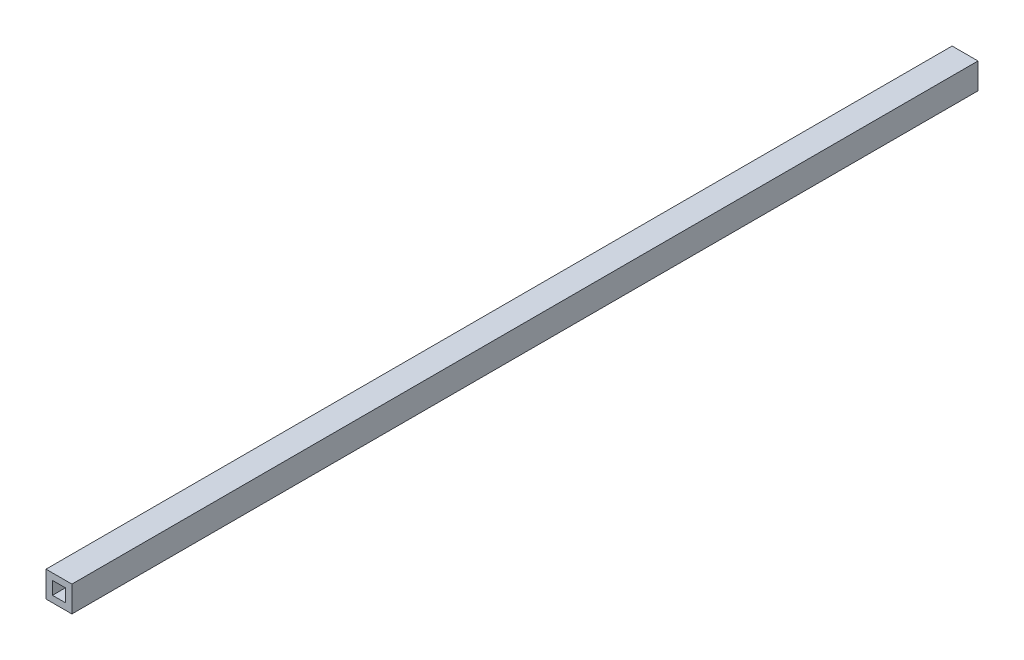
ISO-10303-21;
HEADER;
FILE_DESCRIPTION(('STEP AP214'),'2;1');
FILE_NAME('part.step','',(''),(''),'','','');
FILE_SCHEMA(('AUTOMOTIVE_DESIGN { 1 0 10303 214 1 1 1 1 }'));
ENDSEC;
DATA;
#1=APPLICATION_CONTEXT('core data for automotive mechanical design processes');
#2=APPLICATION_PROTOCOL_DEFINITION('international standard','automotive_design',2000,#1);
#3=PRODUCT_CONTEXT('',#1,'mechanical');
#4=PRODUCT('Part','Part','',(#3));
#5=PRODUCT_RELATED_PRODUCT_CATEGORY('part','',(#4));
#6=PRODUCT_DEFINITION_FORMATION('','',#4);
#7=PRODUCT_DEFINITION_CONTEXT('part definition',#1,'design');
#8=PRODUCT_DEFINITION('design','',#6,#7);
#9=PRODUCT_DEFINITION_SHAPE('','',#8);
#10=(LENGTH_UNIT() NAMED_UNIT(*) SI_UNIT(.MILLI.,.METRE.));
#11=(NAMED_UNIT(*) PLANE_ANGLE_UNIT() SI_UNIT($,.RADIAN.));
#12=(NAMED_UNIT(*) SI_UNIT($,.STERADIAN.) SOLID_ANGLE_UNIT());
#13=UNCERTAINTY_MEASURE_WITH_UNIT(LENGTH_MEASURE(1.E-05),#10,'distance_accuracy_value','');
#14=(GEOMETRIC_REPRESENTATION_CONTEXT(3) GLOBAL_UNCERTAINTY_ASSIGNED_CONTEXT((#13)) GLOBAL_UNIT_ASSIGNED_CONTEXT((#10,
#11,#12)) REPRESENTATION_CONTEXT('',''));
#15=CARTESIAN_POINT('',(0.,0.,0.));
#16=DIRECTION('',(0.,0.,1.));
#17=DIRECTION('',(1.,0.,0.));
#18=AXIS2_PLACEMENT_3D('',#15,#16,#17);
#19=CARTESIAN_POINT('',(0.,0.,700.));
#20=DIRECTION('',(0.,0.,1.));
#21=DIRECTION('',(1.,0.,0.));
#22=AXIS2_PLACEMENT_3D('',#19,#20,#21);
#23=PLANE('',#22);
#24=DIRECTION('',(0.,1.,0.));
#25=VECTOR('',#24,1.);
#26=CARTESIAN_POINT('',(10.,-10.,700.));
#27=LINE('',#26,#25);
#28=CARTESIAN_POINT('',(10.,-10.,700.));
#29=VERTEX_POINT('',#28);
#30=CARTESIAN_POINT('',(10.,10.,700.));
#31=VERTEX_POINT('',#30);
#32=EDGE_CURVE('E158',#29,#31,#27,.T.);
#33=ORIENTED_EDGE('',*,*,#32,.T.);
#34=DIRECTION('',(-1.,0.,0.));
#35=VECTOR('',#34,1.);
#36=CARTESIAN_POINT('',(-10.,10.,700.));
#37=LINE('',#36,#35);
#38=CARTESIAN_POINT('',(-10.,10.,700.));
#39=VERTEX_POINT('',#38);
#40=EDGE_CURVE('E161',#31,#39,#37,.T.);
#41=ORIENTED_EDGE('',*,*,#40,.T.);
#42=DIRECTION('',(0.,-1.,0.));
#43=VECTOR('',#42,1.);
#44=CARTESIAN_POINT('',(-10.,-10.,700.));
#45=LINE('',#44,#43);
#46=CARTESIAN_POINT('',(-10.,-10.,700.));
#47=VERTEX_POINT('',#46);
#48=EDGE_CURVE('E164',#39,#47,#45,.T.);
#49=ORIENTED_EDGE('',*,*,#48,.T.);
#50=DIRECTION('',(1.,0.,0.));
#51=VECTOR('',#50,1.);
#52=CARTESIAN_POINT('',(-10.,-10.,700.));
#53=LINE('',#52,#51);
#54=EDGE_CURVE('E166',#47,#29,#53,.T.);
#55=ORIENTED_EDGE('',*,*,#54,.T.);
#56=EDGE_LOOP('',(#33,#41,#49,#55));
#57=FACE_BOUND('',#56,.T.);
#58=DIRECTION('',(-1.,0.,0.));
#59=VECTOR('',#58,1.);
#60=CARTESIAN_POINT('',(0.,5.,700.));
#61=LINE('',#60,#59);
#62=CARTESIAN_POINT('',(5.,5.,700.));
#63=VERTEX_POINT('',#62);
#64=CARTESIAN_POINT('',(-5.,5.,700.));
#65=VERTEX_POINT('',#64);
#66=EDGE_CURVE('E130',#63,#65,#61,.T.);
#67=ORIENTED_EDGE('',*,*,#66,.F.);
#68=DIRECTION('',(0.,1.,0.));
#69=VECTOR('',#68,1.);
#70=CARTESIAN_POINT('',(5.,0.,700.));
#71=LINE('',#70,#69);
#72=CARTESIAN_POINT('',(5.,-5.,700.));
#73=VERTEX_POINT('',#72);
#74=EDGE_CURVE('E122',#73,#63,#71,.T.);
#75=ORIENTED_EDGE('',*,*,#74,.F.);
#76=DIRECTION('',(1.,0.,0.));
#77=VECTOR('',#76,1.);
#78=CARTESIAN_POINT('',(0.,-5.,700.));
#79=LINE('',#78,#77);
#80=CARTESIAN_POINT('',(-5.,-5.,700.));
#81=VERTEX_POINT('',#80);
#82=EDGE_CURVE('E144',#81,#73,#79,.T.);
#83=ORIENTED_EDGE('',*,*,#82,.F.);
#84=DIRECTION('',(0.,-1.,0.));
#85=VECTOR('',#84,1.);
#86=CARTESIAN_POINT('',(-5.,0.,700.));
#87=LINE('',#86,#85);
#88=EDGE_CURVE('E142',#65,#81,#87,.T.);
#89=ORIENTED_EDGE('',*,*,#88,.F.);
#90=EDGE_LOOP('',(#67,#75,#83,#89));
#91=FACE_BOUND('',#90,.T.);
#92=ADVANCED_FACE('F57',(#57,#91),#23,.T.);
#93=CARTESIAN_POINT('',(0.,0.,0.));
#94=DIRECTION('',(0.,0.,1.));
#95=DIRECTION('',(1.,0.,0.));
#96=AXIS2_PLACEMENT_3D('',#93,#94,#95);
#97=PLANE('',#96);
#98=DIRECTION('',(0.,1.,0.));
#99=VECTOR('',#98,1.);
#100=CARTESIAN_POINT('',(10.,-10.,0.));
#101=LINE('',#100,#99);
#102=CARTESIAN_POINT('',(10.,-10.,0.));
#103=VERTEX_POINT('',#102);
#104=CARTESIAN_POINT('',(10.,10.,0.));
#105=VERTEX_POINT('',#104);
#106=EDGE_CURVE('E138',#103,#105,#101,.T.);
#107=ORIENTED_EDGE('',*,*,#106,.F.);
#108=DIRECTION('',(1.,0.,0.));
#109=VECTOR('',#108,1.);
#110=CARTESIAN_POINT('',(-10.,-10.,0.));
#111=LINE('',#110,#109);
#112=CARTESIAN_POINT('',(-10.,-10.,0.));
#113=VERTEX_POINT('',#112);
#114=EDGE_CURVE('E162',#113,#103,#111,.T.);
#115=ORIENTED_EDGE('',*,*,#114,.F.);
#116=DIRECTION('',(0.,-1.,0.));
#117=VECTOR('',#116,1.);
#118=CARTESIAN_POINT('',(-10.,-10.,0.));
#119=LINE('',#118,#117);
#120=CARTESIAN_POINT('',(-10.,10.,0.));
#121=VERTEX_POINT('',#120);
#122=EDGE_CURVE('E173',#121,#113,#119,.T.);
#123=ORIENTED_EDGE('',*,*,#122,.F.);
#124=DIRECTION('',(-1.,0.,0.));
#125=VECTOR('',#124,1.);
#126=CARTESIAN_POINT('',(-10.,10.,0.));
#127=LINE('',#126,#125);
#128=EDGE_CURVE('E171',#105,#121,#127,.T.);
#129=ORIENTED_EDGE('',*,*,#128,.F.);
#130=EDGE_LOOP('',(#107,#115,#123,#129));
#131=FACE_BOUND('',#130,.T.);
#132=DIRECTION('',(0.,1.,0.));
#133=VECTOR('',#132,1.);
#134=CARTESIAN_POINT('',(5.,0.,0.));
#135=LINE('',#134,#133);
#136=CARTESIAN_POINT('',(5.,-5.,0.));
#137=VERTEX_POINT('',#136);
#138=CARTESIAN_POINT('',(5.,5.,0.));
#139=VERTEX_POINT('',#138);
#140=EDGE_CURVE('E80',#137,#139,#135,.T.);
#141=ORIENTED_EDGE('',*,*,#140,.T.);
#142=DIRECTION('',(-1.,0.,0.));
#143=VECTOR('',#142,1.);
#144=CARTESIAN_POINT('',(0.,5.,0.));
#145=LINE('',#144,#143);
#146=CARTESIAN_POINT('',(-5.,5.,0.));
#147=VERTEX_POINT('',#146);
#148=EDGE_CURVE('E137',#139,#147,#145,.T.);
#149=ORIENTED_EDGE('',*,*,#148,.T.);
#150=DIRECTION('',(0.,-1.,0.));
#151=VECTOR('',#150,1.);
#152=CARTESIAN_POINT('',(-5.,0.,0.));
#153=LINE('',#152,#151);
#154=CARTESIAN_POINT('',(-5.,-5.,0.));
#155=VERTEX_POINT('',#154);
#156=EDGE_CURVE('E150',#147,#155,#153,.T.);
#157=ORIENTED_EDGE('',*,*,#156,.T.);
#158=DIRECTION('',(1.,0.,0.));
#159=VECTOR('',#158,1.);
#160=CARTESIAN_POINT('',(0.,-5.,0.));
#161=LINE('',#160,#159);
#162=EDGE_CURVE('E131',#155,#137,#161,.T.);
#163=ORIENTED_EDGE('',*,*,#162,.T.);
#164=EDGE_LOOP('',(#141,#149,#157,#163));
#165=FACE_BOUND('',#164,.T.);
#166=ADVANCED_FACE('F191',(#131,#165),#97,.F.);
#167=CARTESIAN_POINT('',(10.,-10.,700.));
#168=DIRECTION('',(-1.,0.,0.));
#169=DIRECTION('',(0.,0.,1.));
#170=AXIS2_PLACEMENT_3D('',#167,#168,#169);
#171=PLANE('',#170);
#172=ORIENTED_EDGE('',*,*,#106,.T.);
#173=DIRECTION('',(0.,0.,-1.));
#174=VECTOR('',#173,1.);
#175=CARTESIAN_POINT('',(10.,10.,700.));
#176=LINE('',#175,#174);
#177=EDGE_CURVE('E12',#31,#105,#176,.T.);
#178=ORIENTED_EDGE('',*,*,#177,.F.);
#179=ORIENTED_EDGE('',*,*,#32,.F.);
#180=DIRECTION('',(0.,0.,-1.));
#181=VECTOR('',#180,1.);
#182=CARTESIAN_POINT('',(10.,-10.,700.));
#183=LINE('',#182,#181);
#184=EDGE_CURVE('E168',#29,#103,#183,.T.);
#185=ORIENTED_EDGE('',*,*,#184,.T.);
#186=EDGE_LOOP('',(#172,#178,#179,#185));
#187=FACE_BOUND('',#186,.T.);
#188=ADVANCED_FACE('F59',(#187),#171,.F.);
#189=CARTESIAN_POINT('',(-10.,10.,700.));
#190=DIRECTION('',(0.,-1.,0.));
#191=DIRECTION('',(0.,0.,-1.));
#192=AXIS2_PLACEMENT_3D('',#189,#190,#191);
#193=PLANE('',#192);
#194=ORIENTED_EDGE('',*,*,#128,.T.);
#195=DIRECTION('',(0.,0.,-1.));
#196=VECTOR('',#195,1.);
#197=CARTESIAN_POINT('',(-10.,10.,700.));
#198=LINE('',#197,#196);
#199=EDGE_CURVE('E65',#39,#121,#198,.T.);
#200=ORIENTED_EDGE('',*,*,#199,.F.);
#201=ORIENTED_EDGE('',*,*,#40,.F.);
#202=ORIENTED_EDGE('',*,*,#177,.T.);
#203=EDGE_LOOP('',(#194,#200,#201,#202));
#204=FACE_BOUND('',#203,.T.);
#205=ADVANCED_FACE('F201',(#204),#193,.F.);
#206=CARTESIAN_POINT('',(-10.,-10.,700.));
#207=DIRECTION('',(1.,0.,0.));
#208=DIRECTION('',(0.,0.,-1.));
#209=AXIS2_PLACEMENT_3D('',#206,#207,#208);
#210=PLANE('',#209);
#211=ORIENTED_EDGE('',*,*,#122,.T.);
#212=DIRECTION('',(0.,0.,-1.));
#213=VECTOR('',#212,1.);
#214=CARTESIAN_POINT('',(-10.,-10.,700.));
#215=LINE('',#214,#213);
#216=EDGE_CURVE('E178',#47,#113,#215,.T.);
#217=ORIENTED_EDGE('',*,*,#216,.F.);
#218=ORIENTED_EDGE('',*,*,#48,.F.);
#219=ORIENTED_EDGE('',*,*,#199,.T.);
#220=EDGE_LOOP('',(#211,#217,#218,#219));
#221=FACE_BOUND('',#220,.T.);
#222=ADVANCED_FACE('F185',(#221),#210,.F.);
#223=CARTESIAN_POINT('',(-10.,-10.,700.));
#224=DIRECTION('',(0.,1.,0.));
#225=DIRECTION('',(0.,0.,1.));
#226=AXIS2_PLACEMENT_3D('',#223,#224,#225);
#227=PLANE('',#226);
#228=ORIENTED_EDGE('',*,*,#114,.T.);
#229=ORIENTED_EDGE('',*,*,#184,.F.);
#230=ORIENTED_EDGE('',*,*,#54,.F.);
#231=ORIENTED_EDGE('',*,*,#216,.T.);
#232=EDGE_LOOP('',(#228,#229,#230,#231));
#233=FACE_BOUND('',#232,.T.);
#234=ADVANCED_FACE('F195',(#233),#227,.F.);
#235=CARTESIAN_POINT('',(5.,0.,700.));
#236=DIRECTION('',(-1.,0.,0.));
#237=DIRECTION('',(0.,0.,1.));
#238=AXIS2_PLACEMENT_3D('',#235,#236,#237);
#239=PLANE('',#238);
#240=ORIENTED_EDGE('',*,*,#140,.F.);
#241=DIRECTION('',(0.,0.,-1.));
#242=VECTOR('',#241,1.);
#243=CARTESIAN_POINT('',(5.,-5.,700.));
#244=LINE('',#243,#242);
#245=EDGE_CURVE('E126',#73,#137,#244,.T.);
#246=ORIENTED_EDGE('',*,*,#245,.F.);
#247=ORIENTED_EDGE('',*,*,#74,.T.);
#248=DIRECTION('',(0.,0.,-1.));
#249=VECTOR('',#248,1.);
#250=CARTESIAN_POINT('',(5.,5.,700.));
#251=LINE('',#250,#249);
#252=EDGE_CURVE('E125',#63,#139,#251,.T.);
#253=ORIENTED_EDGE('',*,*,#252,.T.);
#254=EDGE_LOOP('',(#240,#246,#247,#253));
#255=FACE_BOUND('',#254,.T.);
#256=ADVANCED_FACE('F124',(#255),#239,.T.);
#257=CARTESIAN_POINT('',(0.,5.,700.));
#258=DIRECTION('',(0.,-1.,0.));
#259=DIRECTION('',(0.,0.,-1.));
#260=AXIS2_PLACEMENT_3D('',#257,#258,#259);
#261=PLANE('',#260);
#262=ORIENTED_EDGE('',*,*,#148,.F.);
#263=ORIENTED_EDGE('',*,*,#252,.F.);
#264=ORIENTED_EDGE('',*,*,#66,.T.);
#265=DIRECTION('',(0.,0.,-1.));
#266=VECTOR('',#265,1.);
#267=CARTESIAN_POINT('',(-5.,5.,700.));
#268=LINE('',#267,#266);
#269=EDGE_CURVE('E139',#65,#147,#268,.T.);
#270=ORIENTED_EDGE('',*,*,#269,.T.);
#271=EDGE_LOOP('',(#262,#263,#264,#270));
#272=FACE_BOUND('',#271,.T.);
#273=ADVANCED_FACE('F134',(#272),#261,.T.);
#274=CARTESIAN_POINT('',(-5.,0.,700.));
#275=DIRECTION('',(1.,0.,0.));
#276=DIRECTION('',(0.,0.,-1.));
#277=AXIS2_PLACEMENT_3D('',#274,#275,#276);
#278=PLANE('',#277);
#279=ORIENTED_EDGE('',*,*,#156,.F.);
#280=ORIENTED_EDGE('',*,*,#269,.F.);
#281=ORIENTED_EDGE('',*,*,#88,.T.);
#282=DIRECTION('',(0.,0.,-1.));
#283=VECTOR('',#282,1.);
#284=CARTESIAN_POINT('',(-5.,-5.,700.));
#285=LINE('',#284,#283);
#286=EDGE_CURVE('E72',#81,#155,#285,.T.);
#287=ORIENTED_EDGE('',*,*,#286,.T.);
#288=EDGE_LOOP('',(#279,#280,#281,#287));
#289=FACE_BOUND('',#288,.T.);
#290=ADVANCED_FACE('F224',(#289),#278,.T.);
#291=CARTESIAN_POINT('',(0.,-5.,700.));
#292=DIRECTION('',(0.,1.,0.));
#293=DIRECTION('',(0.,0.,1.));
#294=AXIS2_PLACEMENT_3D('',#291,#292,#293);
#295=PLANE('',#294);
#296=ORIENTED_EDGE('',*,*,#162,.F.);
#297=ORIENTED_EDGE('',*,*,#286,.F.);
#298=ORIENTED_EDGE('',*,*,#82,.T.);
#299=ORIENTED_EDGE('',*,*,#245,.T.);
#300=EDGE_LOOP('',(#296,#297,#298,#299));
#301=FACE_BOUND('',#300,.T.);
#302=ADVANCED_FACE('F228',(#301),#295,.T.);
#303=CLOSED_SHELL('',(#92,#166,#188,#205,#222,#234,#256,#273,#290,#302));
#304=MANIFOLD_SOLID_BREP('B2',#303);
#305=ADVANCED_BREP_SHAPE_REPRESENTATION('',(#18,#304),#14);
#306=SHAPE_DEFINITION_REPRESENTATION(#9,#305);
ENDSEC;
END-ISO-10303-21;
